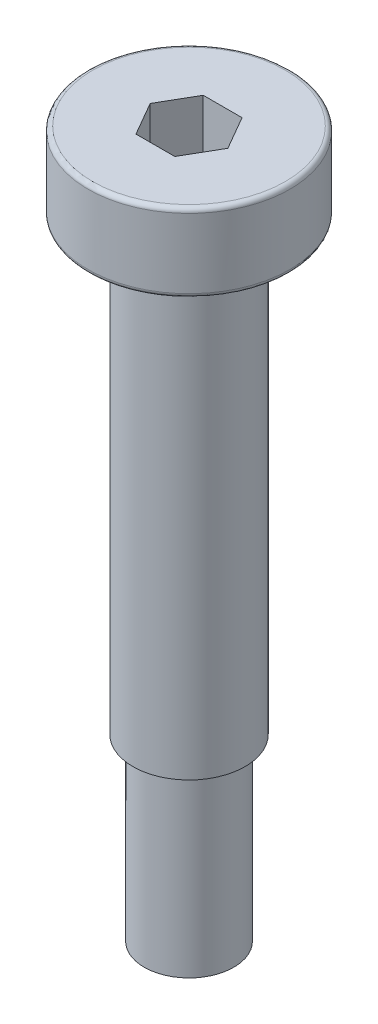
ISO-10303-21;
HEADER;
FILE_DESCRIPTION(('STEP AP214'),'2;1');
FILE_NAME('part.step','',(''),(''),'','','');
FILE_SCHEMA(('AUTOMOTIVE_DESIGN { 1 0 10303 214 1 1 1 1 }'));
ENDSEC;
DATA;
#1=APPLICATION_CONTEXT('core data for automotive mechanical design processes');
#2=APPLICATION_PROTOCOL_DEFINITION('international standard','automotive_design',2000,#1);
#3=PRODUCT_CONTEXT('',#1,'mechanical');
#4=PRODUCT('Part','Part','',(#3));
#5=PRODUCT_RELATED_PRODUCT_CATEGORY('part','',(#4));
#6=PRODUCT_DEFINITION_FORMATION('','',#4);
#7=PRODUCT_DEFINITION_CONTEXT('part definition',#1,'design');
#8=PRODUCT_DEFINITION('design','',#6,#7);
#9=PRODUCT_DEFINITION_SHAPE('','',#8);
#10=(LENGTH_UNIT() NAMED_UNIT(*) SI_UNIT(.MILLI.,.METRE.));
#11=(NAMED_UNIT(*) PLANE_ANGLE_UNIT() SI_UNIT($,.RADIAN.));
#12=(NAMED_UNIT(*) SI_UNIT($,.STERADIAN.) SOLID_ANGLE_UNIT());
#13=UNCERTAINTY_MEASURE_WITH_UNIT(LENGTH_MEASURE(1.E-05),#10,'distance_accuracy_value','');
#14=(GEOMETRIC_REPRESENTATION_CONTEXT(3) GLOBAL_UNCERTAINTY_ASSIGNED_CONTEXT((#13)) GLOBAL_UNIT_ASSIGNED_CONTEXT((#10,
#11,#12)) REPRESENTATION_CONTEXT('',''));
#15=CARTESIAN_POINT('',(0.,0.,0.));
#16=DIRECTION('',(0.,0.,1.));
#17=DIRECTION('',(1.,0.,0.));
#18=AXIS2_PLACEMENT_3D('',#15,#16,#17);
#19=CARTESIAN_POINT('',(0.,0.,0.));
#20=DIRECTION('',(0.,-1.,0.));
#21=DIRECTION('',(1.,0.,0.));
#22=AXIS2_PLACEMENT_3D('',#19,#20,#21);
#23=PLANE('',#22);
#24=CARTESIAN_POINT('',(0.,0.,0.));
#25=DIRECTION('',(0.,1.,0.));
#26=DIRECTION('',(-1.,0.,0.));
#27=AXIS2_PLACEMENT_3D('',#24,#25,#26);
#28=CIRCLE('',#27,2.);
#29=CARTESIAN_POINT('',(-2.,0.,0.));
#30=VERTEX_POINT('',#29);
#31=EDGE_CURVE('E133',#30,#30,#28,.T.);
#32=ORIENTED_EDGE('',*,*,#31,.F.);
#33=EDGE_LOOP('',(#32));
#34=FACE_BOUND('',#33,.T.);
#35=ADVANCED_FACE('F17',(#34),#23,.T.);
#36=CARTESIAN_POINT('',(0.,38.5685719297016,0.));
#37=DIRECTION('',(0.,1.,0.));
#38=DIRECTION('',(-1.,0.,0.));
#39=AXIS2_PLACEMENT_3D('',#36,#37,#38);
#40=CYLINDRICAL_SURFACE('',#39,2.);
#41=ORIENTED_EDGE('',*,*,#31,.T.);
#42=EDGE_LOOP('',(#41));
#43=FACE_BOUND('',#42,.T.);
#44=CARTESIAN_POINT('',(0.,8.,0.));
#45=DIRECTION('',(0.,1.,0.));
#46=DIRECTION('',(-1.,0.,0.));
#47=AXIS2_PLACEMENT_3D('',#44,#45,#46);
#48=CIRCLE('',#47,2.);
#49=CARTESIAN_POINT('',(-2.,8.,0.));
#50=VERTEX_POINT('',#49);
#51=EDGE_CURVE('E130',#50,#50,#48,.T.);
#52=ORIENTED_EDGE('',*,*,#51,.F.);
#53=EDGE_LOOP('',(#52));
#54=FACE_BOUND('',#53,.T.);
#55=ADVANCED_FACE('F174',(#43,#54),#40,.T.);
#56=CARTESIAN_POINT('',(-2.,8.,0.));
#57=DIRECTION('',(0.,-1.,0.));
#58=DIRECTION('',(1.,0.,0.));
#59=AXIS2_PLACEMENT_3D('',#56,#57,#58);
#60=PLANE('',#59);
#61=ORIENTED_EDGE('',*,*,#51,.T.);
#62=EDGE_LOOP('',(#61));
#63=FACE_BOUND('',#62,.T.);
#64=CARTESIAN_POINT('',(0.,8.,0.));
#65=DIRECTION('',(0.,1.,0.));
#66=DIRECTION('',(-1.,0.,0.));
#67=AXIS2_PLACEMENT_3D('',#64,#65,#66);
#68=CIRCLE('',#67,2.5);
#69=CARTESIAN_POINT('',(-2.5,8.,0.));
#70=VERTEX_POINT('',#69);
#71=EDGE_CURVE('E127',#70,#70,#68,.T.);
#72=ORIENTED_EDGE('',*,*,#71,.F.);
#73=EDGE_LOOP('',(#72));
#74=FACE_BOUND('',#73,.T.);
#75=ADVANCED_FACE('F181',(#63,#74),#60,.T.);
#76=CARTESIAN_POINT('',(0.,38.5685719297016,0.));
#77=DIRECTION('',(0.,1.,0.));
#78=DIRECTION('',(-1.,0.,0.));
#79=AXIS2_PLACEMENT_3D('',#76,#77,#78);
#80=CYLINDRICAL_SURFACE('',#79,2.5);
#81=ORIENTED_EDGE('',*,*,#71,.T.);
#82=EDGE_LOOP('',(#81));
#83=FACE_BOUND('',#82,.T.);
#84=CARTESIAN_POINT('',(0.,28.,0.));
#85=DIRECTION('',(0.,1.,0.));
#86=DIRECTION('',(-1.,0.,0.));
#87=AXIS2_PLACEMENT_3D('',#84,#85,#86);
#88=CIRCLE('',#87,2.5);
#89=CARTESIAN_POINT('',(-2.5,28.,0.));
#90=VERTEX_POINT('',#89);
#91=EDGE_CURVE('E119',#90,#90,#88,.T.);
#92=ORIENTED_EDGE('',*,*,#91,.F.);
#93=EDGE_LOOP('',(#92));
#94=FACE_BOUND('',#93,.T.);
#95=ADVANCED_FACE('F188',(#83,#94),#80,.T.);
#96=CARTESIAN_POINT('',(-2.5,28.,0.));
#97=DIRECTION('',(0.,-1.,0.));
#98=DIRECTION('',(1.,0.,0.));
#99=AXIS2_PLACEMENT_3D('',#96,#97,#98);
#100=PLANE('',#99);
#101=CARTESIAN_POINT('',(0.,28.,0.));
#102=DIRECTION('',(0.,-1.,0.));
#103=DIRECTION('',(1.,0.,0.));
#104=AXIS2_PLACEMENT_3D('',#101,#102,#103);
#105=CIRCLE('',#104,4.3);
#106=CARTESIAN_POINT('',(4.3,28.,0.));
#107=VERTEX_POINT('',#106);
#108=EDGE_CURVE('E11',#107,#107,#105,.T.);
#109=ORIENTED_EDGE('',*,*,#108,.T.);
#110=EDGE_LOOP('',(#109));
#111=FACE_BOUND('',#110,.T.);
#112=ORIENTED_EDGE('',*,*,#91,.T.);
#113=EDGE_LOOP('',(#112));
#114=FACE_BOUND('',#113,.T.);
#115=ADVANCED_FACE('F192',(#111,#114),#100,.T.);
#116=CARTESIAN_POINT('',(0.,38.5685719297016,0.));
#117=DIRECTION('',(0.,1.,0.));
#118=DIRECTION('',(-1.,0.,0.));
#119=AXIS2_PLACEMENT_3D('',#116,#117,#118);
#120=CYLINDRICAL_SURFACE('',#119,4.5);
#121=CARTESIAN_POINT('',(0.,31.3,0.));
#122=DIRECTION('',(0.,1.,0.));
#123=DIRECTION('',(-1.,0.,0.));
#124=AXIS2_PLACEMENT_3D('',#121,#122,#123);
#125=CIRCLE('',#124,4.5);
#126=CARTESIAN_POINT('',(-4.5,31.3,0.));
#127=VERTEX_POINT('',#126);
#128=EDGE_CURVE('E25',#127,#127,#125,.F.);
#129=ORIENTED_EDGE('',*,*,#128,.T.);
#130=EDGE_LOOP('',(#129));
#131=FACE_BOUND('',#130,.T.);
#132=CARTESIAN_POINT('',(0.,28.2,0.));
#133=DIRECTION('',(0.,-1.,0.));
#134=DIRECTION('',(1.,0.,0.));
#135=AXIS2_PLACEMENT_3D('',#132,#133,#134);
#136=CIRCLE('',#135,4.5);
#137=CARTESIAN_POINT('',(4.5,28.2,0.));
#138=VERTEX_POINT('',#137);
#139=EDGE_CURVE('E139',#138,#138,#136,.F.);
#140=ORIENTED_EDGE('',*,*,#139,.T.);
#141=EDGE_LOOP('',(#140));
#142=FACE_BOUND('',#141,.T.);
#143=ADVANCED_FACE('F144',(#131,#142),#120,.T.);
#144=CARTESIAN_POINT('',(-4.5,31.5,0.));
#145=DIRECTION('',(0.,1.,0.));
#146=DIRECTION('',(-1.,0.,0.));
#147=AXIS2_PLACEMENT_3D('',#144,#145,#146);
#148=PLANE('',#147);
#149=CARTESIAN_POINT('',(0.,31.5,0.));
#150=DIRECTION('',(0.,1.,0.));
#151=DIRECTION('',(-1.,0.,0.));
#152=AXIS2_PLACEMENT_3D('',#149,#150,#151);
#153=CIRCLE('',#152,4.3);
#154=CARTESIAN_POINT('',(-4.3,31.5,0.));
#155=VERTEX_POINT('',#154);
#156=EDGE_CURVE('E136',#155,#155,#153,.T.);
#157=ORIENTED_EDGE('',*,*,#156,.T.);
#158=EDGE_LOOP('',(#157));
#159=FACE_BOUND('',#158,.T.);
#160=DIRECTION('',(0.5,0.,-0.866025403784439));
#161=VECTOR('',#160,1.);
#162=CARTESIAN_POINT('',(0.866025403784436,31.5,1.5));
#163=LINE('',#162,#161);
#164=CARTESIAN_POINT('',(0.866025403784436,31.5,1.5));
#165=VERTEX_POINT('',#164);
#166=CARTESIAN_POINT('',(1.73205080756887,31.5,0.));
#167=VERTEX_POINT('',#166);
#168=EDGE_CURVE('E32',#165,#167,#163,.T.);
#169=ORIENTED_EDGE('',*,*,#168,.F.);
#170=DIRECTION('',(1.,0.,0.));
#171=VECTOR('',#170,1.);
#172=CARTESIAN_POINT('',(-0.866025403784442,31.5,1.5));
#173=LINE('',#172,#171);
#174=CARTESIAN_POINT('',(-0.866025403784442,31.5,1.5));
#175=VERTEX_POINT('',#174);
#176=EDGE_CURVE('E115',#175,#165,#173,.T.);
#177=ORIENTED_EDGE('',*,*,#176,.F.);
#178=DIRECTION('',(0.5,0.,0.866025403784439));
#179=VECTOR('',#178,1.);
#180=CARTESIAN_POINT('',(-1.73205080756888,31.5,0.));
#181=LINE('',#180,#179);
#182=CARTESIAN_POINT('',(-1.73205080756888,31.5,0.));
#183=VERTEX_POINT('',#182);
#184=EDGE_CURVE('E113',#183,#175,#181,.T.);
#185=ORIENTED_EDGE('',*,*,#184,.F.);
#186=DIRECTION('',(-0.5,0.,0.866025403784439));
#187=VECTOR('',#186,1.);
#188=CARTESIAN_POINT('',(-0.866025403784442,31.5,-1.5));
#189=LINE('',#188,#187);
#190=CARTESIAN_POINT('',(-0.866025403784442,31.5,-1.5));
#191=VERTEX_POINT('',#190);
#192=EDGE_CURVE('E80',#191,#183,#189,.T.);
#193=ORIENTED_EDGE('',*,*,#192,.F.);
#194=DIRECTION('',(-1.,0.,0.));
#195=VECTOR('',#194,1.);
#196=CARTESIAN_POINT('',(0.866025403784436,31.5,-1.5));
#197=LINE('',#196,#195);
#198=CARTESIAN_POINT('',(0.866025403784436,31.5,-1.5));
#199=VERTEX_POINT('',#198);
#200=EDGE_CURVE('E109',#199,#191,#197,.T.);
#201=ORIENTED_EDGE('',*,*,#200,.F.);
#202=DIRECTION('',(-0.5,0.,-0.866025403784439));
#203=VECTOR('',#202,1.);
#204=CARTESIAN_POINT('',(1.73205080756887,31.5,0.));
#205=LINE('',#204,#203);
#206=EDGE_CURVE('E106',#167,#199,#205,.T.);
#207=ORIENTED_EDGE('',*,*,#206,.F.);
#208=EDGE_LOOP('',(#169,#177,#185,#193,#201,#207));
#209=FACE_BOUND('',#208,.T.);
#210=ADVANCED_FACE('F152',(#159,#209),#148,.T.);
#211=CARTESIAN_POINT('',(0.866025403784437,28.5,1.5));
#212=DIRECTION('',(0.866025403784439,0.,0.5));
#213=DIRECTION('',(0.5,0.,-0.866025403784439));
#214=AXIS2_PLACEMENT_3D('',#211,#212,#213);
#215=PLANE('',#214);
#216=ORIENTED_EDGE('',*,*,#168,.T.);
#217=DIRECTION('',(0.,1.,0.));
#218=VECTOR('',#217,1.);
#219=CARTESIAN_POINT('',(1.73205080756887,28.5,0.));
#220=LINE('',#219,#218);
#221=CARTESIAN_POINT('',(1.73205080756887,28.5,0.));
#222=VERTEX_POINT('',#221);
#223=EDGE_CURVE('E62',#222,#167,#220,.T.);
#224=ORIENTED_EDGE('',*,*,#223,.F.);
#225=DIRECTION('',(0.5,0.,-0.866025403784439));
#226=VECTOR('',#225,1.);
#227=CARTESIAN_POINT('',(0.866025403784437,28.5,1.5));
#228=LINE('',#227,#226);
#229=CARTESIAN_POINT('',(0.866025403784437,28.5,1.5));
#230=VERTEX_POINT('',#229);
#231=EDGE_CURVE('E117',#230,#222,#228,.T.);
#232=ORIENTED_EDGE('',*,*,#231,.F.);
#233=DIRECTION('',(0.,1.,0.));
#234=VECTOR('',#233,1.);
#235=CARTESIAN_POINT('',(0.866025403784437,28.5,1.5));
#236=LINE('',#235,#234);
#237=EDGE_CURVE('E40',#230,#165,#236,.T.);
#238=ORIENTED_EDGE('',*,*,#237,.T.);
#239=EDGE_LOOP('',(#216,#224,#232,#238));
#240=FACE_BOUND('',#239,.T.);
#241=ADVANCED_FACE('F155',(#240),#215,.F.);
#242=CARTESIAN_POINT('',(-0.866025403784441,28.5,1.5));
#243=DIRECTION('',(0.,0.,1.));
#244=DIRECTION('',(1.,0.,0.));
#245=AXIS2_PLACEMENT_3D('',#242,#243,#244);
#246=PLANE('',#245);
#247=ORIENTED_EDGE('',*,*,#176,.T.);
#248=ORIENTED_EDGE('',*,*,#237,.F.);
#249=DIRECTION('',(1.,0.,0.));
#250=VECTOR('',#249,1.);
#251=CARTESIAN_POINT('',(-0.866025403784441,28.5,1.5));
#252=LINE('',#251,#250);
#253=CARTESIAN_POINT('',(-0.866025403784441,28.5,1.5));
#254=VERTEX_POINT('',#253);
#255=EDGE_CURVE('E92',#254,#230,#252,.T.);
#256=ORIENTED_EDGE('',*,*,#255,.F.);
#257=DIRECTION('',(0.,1.,0.));
#258=VECTOR('',#257,1.);
#259=CARTESIAN_POINT('',(-0.866025403784441,28.5,1.5));
#260=LINE('',#259,#258);
#261=EDGE_CURVE('E84',#254,#175,#260,.T.);
#262=ORIENTED_EDGE('',*,*,#261,.T.);
#263=EDGE_LOOP('',(#247,#248,#256,#262));
#264=FACE_BOUND('',#263,.T.);
#265=ADVANCED_FACE('F164',(#264),#246,.F.);
#266=CARTESIAN_POINT('',(-1.73205080756888,28.5,0.));
#267=DIRECTION('',(-0.866025403784439,0.,0.5));
#268=DIRECTION('',(0.5,0.,0.866025403784439));
#269=AXIS2_PLACEMENT_3D('',#266,#267,#268);
#270=PLANE('',#269);
#271=ORIENTED_EDGE('',*,*,#184,.T.);
#272=ORIENTED_EDGE('',*,*,#261,.F.);
#273=DIRECTION('',(0.5,0.,0.866025403784439));
#274=VECTOR('',#273,1.);
#275=CARTESIAN_POINT('',(-1.73205080756888,28.5,0.));
#276=LINE('',#275,#274);
#277=CARTESIAN_POINT('',(-1.73205080756888,28.5,0.));
#278=VERTEX_POINT('',#277);
#279=EDGE_CURVE('E88',#278,#254,#276,.T.);
#280=ORIENTED_EDGE('',*,*,#279,.F.);
#281=DIRECTION('',(0.,1.,0.));
#282=VECTOR('',#281,1.);
#283=CARTESIAN_POINT('',(-1.73205080756888,28.5,0.));
#284=LINE('',#283,#282);
#285=EDGE_CURVE('E73',#278,#183,#284,.T.);
#286=ORIENTED_EDGE('',*,*,#285,.T.);
#287=EDGE_LOOP('',(#271,#272,#280,#286));
#288=FACE_BOUND('',#287,.T.);
#289=ADVANCED_FACE('F89',(#288),#270,.F.);
#290=CARTESIAN_POINT('',(-0.866025403784441,28.5,-1.5));
#291=DIRECTION('',(-0.866025403784439,0.,-0.5));
#292=DIRECTION('',(-0.5,0.,0.866025403784439));
#293=AXIS2_PLACEMENT_3D('',#290,#291,#292);
#294=PLANE('',#293);
#295=ORIENTED_EDGE('',*,*,#192,.T.);
#296=ORIENTED_EDGE('',*,*,#285,.F.);
#297=DIRECTION('',(-0.5,0.,0.866025403784439));
#298=VECTOR('',#297,1.);
#299=CARTESIAN_POINT('',(-0.866025403784441,28.5,-1.5));
#300=LINE('',#299,#298);
#301=CARTESIAN_POINT('',(-0.866025403784441,28.5,-1.5));
#302=VERTEX_POINT('',#301);
#303=EDGE_CURVE('E77',#302,#278,#300,.T.);
#304=ORIENTED_EDGE('',*,*,#303,.F.);
#305=DIRECTION('',(0.,1.,0.));
#306=VECTOR('',#305,1.);
#307=CARTESIAN_POINT('',(-0.866025403784441,28.5,-1.5));
#308=LINE('',#307,#306);
#309=EDGE_CURVE('E85',#302,#191,#308,.T.);
#310=ORIENTED_EDGE('',*,*,#309,.T.);
#311=EDGE_LOOP('',(#295,#296,#304,#310));
#312=FACE_BOUND('',#311,.T.);
#313=ADVANCED_FACE('F75',(#312),#294,.F.);
#314=CARTESIAN_POINT('',(0.866025403784436,28.5,-1.5));
#315=DIRECTION('',(0.,0.,-1.));
#316=DIRECTION('',(-1.,0.,0.));
#317=AXIS2_PLACEMENT_3D('',#314,#315,#316);
#318=PLANE('',#317);
#319=ORIENTED_EDGE('',*,*,#200,.T.);
#320=ORIENTED_EDGE('',*,*,#309,.F.);
#321=DIRECTION('',(-1.,0.,0.));
#322=VECTOR('',#321,1.);
#323=CARTESIAN_POINT('',(0.866025403784436,28.5,-1.5));
#324=LINE('',#323,#322);
#325=CARTESIAN_POINT('',(0.866025403784436,28.5,-1.5));
#326=VERTEX_POINT('',#325);
#327=EDGE_CURVE('E98',#326,#302,#324,.T.);
#328=ORIENTED_EDGE('',*,*,#327,.F.);
#329=DIRECTION('',(0.,1.,0.));
#330=VECTOR('',#329,1.);
#331=CARTESIAN_POINT('',(0.866025403784436,28.5,-1.5));
#332=LINE('',#331,#330);
#333=EDGE_CURVE('E122',#326,#199,#332,.T.);
#334=ORIENTED_EDGE('',*,*,#333,.T.);
#335=EDGE_LOOP('',(#319,#320,#328,#334));
#336=FACE_BOUND('',#335,.T.);
#337=ADVANCED_FACE('F241',(#336),#318,.F.);
#338=CARTESIAN_POINT('',(1.73205080756887,28.5,0.));
#339=DIRECTION('',(0.866025403784438,0.,-0.5));
#340=DIRECTION('',(-0.5,0.,-0.866025403784439));
#341=AXIS2_PLACEMENT_3D('',#338,#339,#340);
#342=PLANE('',#341);
#343=ORIENTED_EDGE('',*,*,#206,.T.);
#344=ORIENTED_EDGE('',*,*,#333,.F.);
#345=DIRECTION('',(-0.5,0.,-0.866025403784439));
#346=VECTOR('',#345,1.);
#347=CARTESIAN_POINT('',(1.73205080756887,28.5,0.));
#348=LINE('',#347,#346);
#349=EDGE_CURVE('E100',#222,#326,#348,.T.);
#350=ORIENTED_EDGE('',*,*,#349,.F.);
#351=ORIENTED_EDGE('',*,*,#223,.T.);
#352=EDGE_LOOP('',(#343,#344,#350,#351));
#353=FACE_BOUND('',#352,.T.);
#354=ADVANCED_FACE('F161',(#353),#342,.F.);
#355=CARTESIAN_POINT('',(0.,28.5,0.));
#356=DIRECTION('',(0.,1.,0.));
#357=DIRECTION('',(0.,0.,1.));
#358=AXIS2_PLACEMENT_3D('',#355,#356,#357);
#359=PLANE('',#358);
#360=ORIENTED_EDGE('',*,*,#231,.T.);
#361=ORIENTED_EDGE('',*,*,#349,.T.);
#362=ORIENTED_EDGE('',*,*,#327,.T.);
#363=ORIENTED_EDGE('',*,*,#303,.T.);
#364=ORIENTED_EDGE('',*,*,#279,.T.);
#365=ORIENTED_EDGE('',*,*,#255,.T.);
#366=EDGE_LOOP('',(#360,#361,#362,#363,#364,#365));
#367=FACE_BOUND('',#366,.T.);
#368=ADVANCED_FACE('F95',(#367),#359,.T.);
#369=CARTESIAN_POINT('',(0.,31.3,0.));
#370=DIRECTION('',(0.,1.,0.));
#371=DIRECTION('',(-1.,0.,0.));
#372=AXIS2_PLACEMENT_3D('',#369,#370,#371);
#373=TOROIDAL_SURFACE('',#372,4.3,0.2);
#374=ORIENTED_EDGE('',*,*,#128,.F.);
#375=EDGE_LOOP('',(#374));
#376=FACE_BOUND('',#375,.T.);
#377=ORIENTED_EDGE('',*,*,#156,.F.);
#378=EDGE_LOOP('',(#377));
#379=FACE_BOUND('',#378,.T.);
#380=ADVANCED_FACE('F147',(#376,#379),#373,.T.);
#381=CARTESIAN_POINT('',(0.,28.2,0.));
#382=DIRECTION('',(0.,-1.,0.));
#383=DIRECTION('',(1.,0.,0.));
#384=AXIS2_PLACEMENT_3D('',#381,#382,#383);
#385=TOROIDAL_SURFACE('',#384,4.3,0.2);
#386=ORIENTED_EDGE('',*,*,#108,.F.);
#387=EDGE_LOOP('',(#386));
#388=FACE_BOUND('',#387,.T.);
#389=ORIENTED_EDGE('',*,*,#139,.F.);
#390=EDGE_LOOP('',(#389));
#391=FACE_BOUND('',#390,.T.);
#392=ADVANCED_FACE('F19',(#388,#391),#385,.T.);
#393=CLOSED_SHELL('',(#35,#55,#75,#95,#115,#143,#210,#241,#265,#289,#313,#337,#354,#368,#380,#392));
#394=MANIFOLD_SOLID_BREP('B1',#393);
#395=ADVANCED_BREP_SHAPE_REPRESENTATION('',(#18,#394),#14);
#396=SHAPE_DEFINITION_REPRESENTATION(#9,#395);
ENDSEC;
END-ISO-10303-21;
